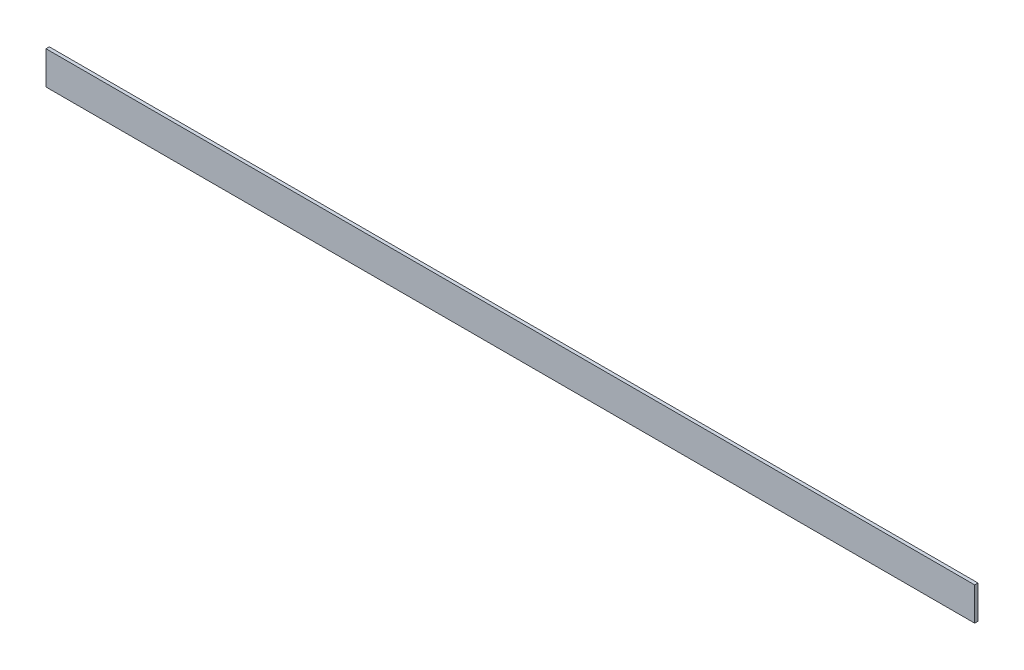
ISO-10303-21;
HEADER;
FILE_DESCRIPTION(('STEP AP214'),'2;1');
FILE_NAME('part.step','',(''),(''),'','','');
FILE_SCHEMA(('AUTOMOTIVE_DESIGN { 1 0 10303 214 1 1 1 1 }'));
ENDSEC;
DATA;
#1=APPLICATION_CONTEXT('core data for automotive mechanical design processes');
#2=APPLICATION_PROTOCOL_DEFINITION('international standard','automotive_design',2000,#1);
#3=PRODUCT_CONTEXT('',#1,'mechanical');
#4=PRODUCT('Part','Part','',(#3));
#5=PRODUCT_RELATED_PRODUCT_CATEGORY('part','',(#4));
#6=PRODUCT_DEFINITION_FORMATION('','',#4);
#7=PRODUCT_DEFINITION_CONTEXT('part definition',#1,'design');
#8=PRODUCT_DEFINITION('design','',#6,#7);
#9=PRODUCT_DEFINITION_SHAPE('','',#8);
#10=(LENGTH_UNIT() NAMED_UNIT(*) SI_UNIT(.MILLI.,.METRE.));
#11=(NAMED_UNIT(*) PLANE_ANGLE_UNIT() SI_UNIT($,.RADIAN.));
#12=(NAMED_UNIT(*) SI_UNIT($,.STERADIAN.) SOLID_ANGLE_UNIT());
#13=UNCERTAINTY_MEASURE_WITH_UNIT(LENGTH_MEASURE(1.E-05),#10,'distance_accuracy_value','');
#14=(GEOMETRIC_REPRESENTATION_CONTEXT(3) GLOBAL_UNCERTAINTY_ASSIGNED_CONTEXT((#13)) GLOBAL_UNIT_ASSIGNED_CONTEXT((#10,
#11,#12)) REPRESENTATION_CONTEXT('',''));
#15=CARTESIAN_POINT('',(0.,0.,0.));
#16=DIRECTION('',(0.,0.,1.));
#17=DIRECTION('',(1.,0.,0.));
#18=AXIS2_PLACEMENT_3D('',#15,#16,#17);
#19=CARTESIAN_POINT('',(-280.,-10.,2.));
#20=DIRECTION('',(1.,0.,0.));
#21=DIRECTION('',(0.,0.,-1.));
#22=AXIS2_PLACEMENT_3D('',#19,#20,#21);
#23=PLANE('',#22);
#24=DIRECTION('',(0.,-1.,0.));
#25=VECTOR('',#24,1.);
#26=CARTESIAN_POINT('',(-280.,-10.,0.));
#27=LINE('',#26,#25);
#28=CARTESIAN_POINT('',(-280.,9.99999999999996,0.));
#29=VERTEX_POINT('',#28);
#30=CARTESIAN_POINT('',(-280.,-10.,0.));
#31=VERTEX_POINT('',#30);
#32=EDGE_CURVE('E95',#29,#31,#27,.T.);
#33=ORIENTED_EDGE('',*,*,#32,.T.);
#34=DIRECTION('',(0.,0.,-1.));
#35=VECTOR('',#34,1.);
#36=CARTESIAN_POINT('',(-280.,-10.,2.));
#37=LINE('',#36,#35);
#38=CARTESIAN_POINT('',(-280.,-10.,2.));
#39=VERTEX_POINT('',#38);
#40=EDGE_CURVE('E11',#39,#31,#37,.T.);
#41=ORIENTED_EDGE('',*,*,#40,.F.);
#42=DIRECTION('',(0.,-1.,0.));
#43=VECTOR('',#42,1.);
#44=CARTESIAN_POINT('',(-280.,-10.,2.));
#45=LINE('',#44,#43);
#46=CARTESIAN_POINT('',(-280.,9.99999999999996,2.));
#47=VERTEX_POINT('',#46);
#48=EDGE_CURVE('E83',#47,#39,#45,.T.);
#49=ORIENTED_EDGE('',*,*,#48,.F.);
#50=DIRECTION('',(0.,0.,-1.));
#51=VECTOR('',#50,1.);
#52=CARTESIAN_POINT('',(-280.,9.99999999999996,2.));
#53=LINE('',#52,#51);
#54=EDGE_CURVE('E91',#47,#29,#53,.T.);
#55=ORIENTED_EDGE('',*,*,#54,.T.);
#56=EDGE_LOOP('',(#33,#41,#49,#55));
#57=FACE_BOUND('',#56,.T.);
#58=ADVANCED_FACE('F32',(#57),#23,.F.);
#59=CARTESIAN_POINT('',(280.,-9.99999999999997,2.));
#60=DIRECTION('',(0.,1.,0.));
#61=DIRECTION('',(-1.,0.,0.));
#62=AXIS2_PLACEMENT_3D('',#59,#60,#61);
#63=PLANE('',#62);
#64=DIRECTION('',(1.,0.,0.));
#65=VECTOR('',#64,1.);
#66=CARTESIAN_POINT('',(280.,-9.99999999999997,0.));
#67=LINE('',#66,#65);
#68=CARTESIAN_POINT('',(280.,-9.99999999999997,0.));
#69=VERTEX_POINT('',#68);
#70=EDGE_CURVE('E87',#31,#69,#67,.T.);
#71=ORIENTED_EDGE('',*,*,#70,.T.);
#72=DIRECTION('',(0.,0.,-1.));
#73=VECTOR('',#72,1.);
#74=CARTESIAN_POINT('',(280.,-9.99999999999997,2.));
#75=LINE('',#74,#73);
#76=CARTESIAN_POINT('',(280.,-9.99999999999997,2.));
#77=VERTEX_POINT('',#76);
#78=EDGE_CURVE('E40',#77,#69,#75,.T.);
#79=ORIENTED_EDGE('',*,*,#78,.F.);
#80=DIRECTION('',(1.,0.,0.));
#81=VECTOR('',#80,1.);
#82=CARTESIAN_POINT('',(280.,-9.99999999999997,2.));
#83=LINE('',#82,#81);
#84=EDGE_CURVE('E78',#39,#77,#83,.T.);
#85=ORIENTED_EDGE('',*,*,#84,.F.);
#86=ORIENTED_EDGE('',*,*,#40,.T.);
#87=EDGE_LOOP('',(#71,#79,#85,#86));
#88=FACE_BOUND('',#87,.T.);
#89=ADVANCED_FACE('F86',(#88),#63,.F.);
#90=CARTESIAN_POINT('',(280.,-9.99999999999997,2.));
#91=DIRECTION('',(-1.,0.,0.));
#92=DIRECTION('',(0.,0.,1.));
#93=AXIS2_PLACEMENT_3D('',#90,#91,#92);
#94=PLANE('',#93);
#95=DIRECTION('',(0.,1.,0.));
#96=VECTOR('',#95,1.);
#97=CARTESIAN_POINT('',(280.,-9.99999999999997,0.));
#98=LINE('',#97,#96);
#99=CARTESIAN_POINT('',(280.,10.,0.));
#100=VERTEX_POINT('',#99);
#101=EDGE_CURVE('E65',#69,#100,#98,.T.);
#102=ORIENTED_EDGE('',*,*,#101,.T.);
#103=DIRECTION('',(0.,0.,-1.));
#104=VECTOR('',#103,1.);
#105=CARTESIAN_POINT('',(280.,10.,2.));
#106=LINE('',#105,#104);
#107=CARTESIAN_POINT('',(280.,10.,2.));
#108=VERTEX_POINT('',#107);
#109=EDGE_CURVE('E88',#108,#100,#106,.T.);
#110=ORIENTED_EDGE('',*,*,#109,.F.);
#111=DIRECTION('',(0.,1.,0.));
#112=VECTOR('',#111,1.);
#113=CARTESIAN_POINT('',(280.,-9.99999999999997,2.));
#114=LINE('',#113,#112);
#115=EDGE_CURVE('E81',#77,#108,#114,.T.);
#116=ORIENTED_EDGE('',*,*,#115,.F.);
#117=ORIENTED_EDGE('',*,*,#78,.T.);
#118=EDGE_LOOP('',(#102,#110,#116,#117));
#119=FACE_BOUND('',#118,.T.);
#120=ADVANCED_FACE('F89',(#119),#94,.F.);
#121=CARTESIAN_POINT('',(280.,10.,2.));
#122=DIRECTION('',(0.,-1.,0.));
#123=DIRECTION('',(1.,0.,0.));
#124=AXIS2_PLACEMENT_3D('',#121,#122,#123);
#125=PLANE('',#124);
#126=DIRECTION('',(-1.,0.,0.));
#127=VECTOR('',#126,1.);
#128=CARTESIAN_POINT('',(280.,10.,0.));
#129=LINE('',#128,#127);
#130=EDGE_CURVE('E71',#100,#29,#129,.T.);
#131=ORIENTED_EDGE('',*,*,#130,.T.);
#132=ORIENTED_EDGE('',*,*,#54,.F.);
#133=DIRECTION('',(-1.,0.,0.));
#134=VECTOR('',#133,1.);
#135=CARTESIAN_POINT('',(280.,10.,2.));
#136=LINE('',#135,#134);
#137=EDGE_CURVE('E48',#108,#47,#136,.T.);
#138=ORIENTED_EDGE('',*,*,#137,.F.);
#139=ORIENTED_EDGE('',*,*,#109,.T.);
#140=EDGE_LOOP('',(#131,#132,#138,#139));
#141=FACE_BOUND('',#140,.T.);
#142=ADVANCED_FACE('F102',(#141),#125,.F.);
#143=CARTESIAN_POINT('',(0.,0.,2.));
#144=DIRECTION('',(0.,0.,1.));
#145=DIRECTION('',(1.,0.,0.));
#146=AXIS2_PLACEMENT_3D('',#143,#144,#145);
#147=PLANE('',#146);
#148=ORIENTED_EDGE('',*,*,#48,.T.);
#149=ORIENTED_EDGE('',*,*,#84,.T.);
#150=ORIENTED_EDGE('',*,*,#115,.T.);
#151=ORIENTED_EDGE('',*,*,#137,.T.);
#152=EDGE_LOOP('',(#148,#149,#150,#151));
#153=FACE_BOUND('',#152,.T.);
#154=ADVANCED_FACE('F79',(#153),#147,.T.);
#155=CARTESIAN_POINT('',(0.,0.,0.));
#156=DIRECTION('',(0.,0.,1.));
#157=DIRECTION('',(1.,0.,0.));
#158=AXIS2_PLACEMENT_3D('',#155,#156,#157);
#159=PLANE('',#158);
#160=ORIENTED_EDGE('',*,*,#32,.F.);
#161=ORIENTED_EDGE('',*,*,#130,.F.);
#162=ORIENTED_EDGE('',*,*,#101,.F.);
#163=ORIENTED_EDGE('',*,*,#70,.F.);
#164=EDGE_LOOP('',(#160,#161,#162,#163));
#165=FACE_BOUND('',#164,.T.);
#166=ADVANCED_FACE('F105',(#165),#159,.F.);
#167=CLOSED_SHELL('',(#58,#89,#120,#142,#154,#166));
#168=MANIFOLD_SOLID_BREP('B2',#167);
#169=ADVANCED_BREP_SHAPE_REPRESENTATION('',(#18,#168),#14);
#170=SHAPE_DEFINITION_REPRESENTATION(#9,#169);
ENDSEC;
END-ISO-10303-21;
